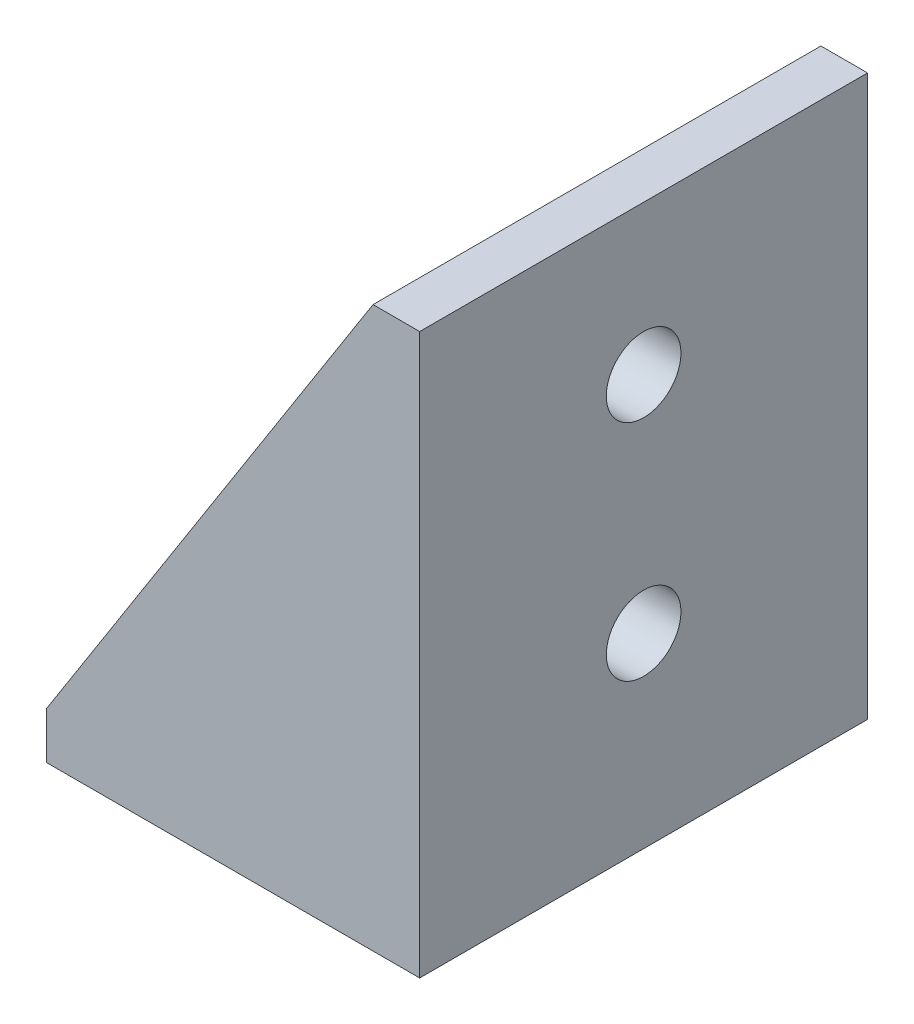
ISO-10303-21;
HEADER;
FILE_DESCRIPTION(('STEP AP214'),'2;1');
FILE_NAME('part.step','',(''),(''),'','','');
FILE_SCHEMA(('AUTOMOTIVE_DESIGN { 1 0 10303 214 1 1 1 1 }'));
ENDSEC;
DATA;
#1=APPLICATION_CONTEXT('core data for automotive mechanical design processes');
#2=APPLICATION_PROTOCOL_DEFINITION('international standard','automotive_design',2000,#1);
#3=PRODUCT_CONTEXT('',#1,'mechanical');
#4=PRODUCT('Part','Part','',(#3));
#5=PRODUCT_RELATED_PRODUCT_CATEGORY('part','',(#4));
#6=PRODUCT_DEFINITION_FORMATION('','',#4);
#7=PRODUCT_DEFINITION_CONTEXT('part definition',#1,'design');
#8=PRODUCT_DEFINITION('design','',#6,#7);
#9=PRODUCT_DEFINITION_SHAPE('','',#8);
#10=(LENGTH_UNIT() NAMED_UNIT(*) SI_UNIT(.MILLI.,.METRE.));
#11=(NAMED_UNIT(*) PLANE_ANGLE_UNIT() SI_UNIT($,.RADIAN.));
#12=(NAMED_UNIT(*) SI_UNIT($,.STERADIAN.) SOLID_ANGLE_UNIT());
#13=UNCERTAINTY_MEASURE_WITH_UNIT(LENGTH_MEASURE(1.E-05),#10,'distance_accuracy_value','');
#14=(GEOMETRIC_REPRESENTATION_CONTEXT(3) GLOBAL_UNCERTAINTY_ASSIGNED_CONTEXT((#13)) GLOBAL_UNIT_ASSIGNED_CONTEXT((#10,
#11,#12)) REPRESENTATION_CONTEXT('',''));
#15=CARTESIAN_POINT('',(0.,0.,0.));
#16=DIRECTION('',(0.,0.,1.));
#17=DIRECTION('',(1.,0.,0.));
#18=AXIS2_PLACEMENT_3D('',#15,#16,#17);
#19=CARTESIAN_POINT('',(20.,2.5,-18.3));
#20=DIRECTION('',(0.,0.,1.));
#21=DIRECTION('',(1.,0.,0.));
#22=AXIS2_PLACEMENT_3D('',#19,#20,#21);
#23=PLANE('',#22);
#24=DIRECTION('',(-1.,0.,0.));
#25=VECTOR('',#24,1.);
#26=CARTESIAN_POINT('',(15.3,4.5,-18.3));
#27=LINE('',#26,#25);
#28=CARTESIAN_POINT('',(15.3,4.5,-18.3));
#29=VERTEX_POINT('',#28);
#30=CARTESIAN_POINT('',(1.27272727272727,4.49999999999999,-18.3));
#31=VERTEX_POINT('',#30);
#32=EDGE_CURVE('E168',#29,#31,#27,.T.);
#33=ORIENTED_EDGE('',*,*,#32,.F.);
#34=DIRECTION('',(0.,-1.,0.));
#35=VECTOR('',#34,1.);
#36=CARTESIAN_POINT('',(15.3,26.5428571428571,-18.3));
#37=LINE('',#36,#35);
#38=CARTESIAN_POINT('',(15.3,26.5428571428571,-18.3));
#39=VERTEX_POINT('',#38);
#40=EDGE_CURVE('E179',#39,#29,#37,.T.);
#41=ORIENTED_EDGE('',*,*,#40,.F.);
#42=DIRECTION('',(0.536875492193159,0.843661487732108,0.));
#43=VECTOR('',#42,1.);
#44=CARTESIAN_POINT('',(17.5,30.,-18.3));
#45=LINE('',#44,#43);
#46=EDGE_CURVE('E42',#31,#39,#45,.T.);
#47=ORIENTED_EDGE('',*,*,#46,.F.);
#48=EDGE_LOOP('',(#33,#41,#47));
#49=FACE_BOUND('',#48,.T.);
#50=ADVANCED_FACE('F33',(#49),#23,.T.);
#51=CARTESIAN_POINT('',(20.,2.5,-1.7));
#52=DIRECTION('',(0.,0.,-1.));
#53=DIRECTION('',(-1.,0.,0.));
#54=AXIS2_PLACEMENT_3D('',#51,#52,#53);
#55=PLANE('',#54);
#56=DIRECTION('',(1.,0.,0.));
#57=VECTOR('',#56,1.);
#58=CARTESIAN_POINT('',(0.,4.5,-1.7));
#59=LINE('',#58,#57);
#60=CARTESIAN_POINT('',(1.27272727272727,4.49999999999999,-1.7));
#61=VERTEX_POINT('',#60);
#62=CARTESIAN_POINT('',(15.3,4.49999999999999,-1.7));
#63=VERTEX_POINT('',#62);
#64=EDGE_CURVE('E50',#61,#63,#59,.T.);
#65=ORIENTED_EDGE('',*,*,#64,.F.);
#66=DIRECTION('',(-0.536875492193159,-0.843661487732108,0.));
#67=VECTOR('',#66,1.);
#68=CARTESIAN_POINT('',(17.5,30.,-1.7));
#69=LINE('',#68,#67);
#70=CARTESIAN_POINT('',(15.3,26.5428571428571,-1.7));
#71=VERTEX_POINT('',#70);
#72=EDGE_CURVE('E194',#71,#61,#69,.T.);
#73=ORIENTED_EDGE('',*,*,#72,.F.);
#74=DIRECTION('',(0.,1.,0.));
#75=VECTOR('',#74,1.);
#76=CARTESIAN_POINT('',(15.3,26.5428571428571,-1.7));
#77=LINE('',#76,#75);
#78=EDGE_CURVE('E184',#63,#71,#77,.T.);
#79=ORIENTED_EDGE('',*,*,#78,.F.);
#80=EDGE_LOOP('',(#65,#73,#79));
#81=FACE_BOUND('',#80,.T.);
#82=ADVANCED_FACE('F231',(#81),#55,.T.);
#83=CARTESIAN_POINT('',(17.5,30.,-20.));
#84=DIRECTION('',(-0.843661487732108,0.536875492193159,0.));
#85=DIRECTION('',(-0.536875492193159,-0.843661487732108,0.));
#86=AXIS2_PLACEMENT_3D('',#83,#84,#85);
#87=PLANE('',#86);
#88=DIRECTION('',(0.,0.,1.));
#89=VECTOR('',#88,1.);
#90=CARTESIAN_POINT('',(0.,2.5,-20.));
#91=LINE('',#90,#89);
#92=CARTESIAN_POINT('',(0.,2.5,-1.7));
#93=VERTEX_POINT('',#92);
#94=CARTESIAN_POINT('',(0.,2.5,2.));
#95=VERTEX_POINT('',#94);
#96=EDGE_CURVE('E113',#93,#95,#91,.T.);
#97=ORIENTED_EDGE('',*,*,#96,.T.);
#98=DIRECTION('',(-0.536875492193159,-0.843661487732108,0.));
#99=VECTOR('',#98,1.);
#100=CARTESIAN_POINT('',(-1.13235294117647,0.720588235294116,2.));
#101=LINE('',#100,#99);
#102=CARTESIAN_POINT('',(17.5,30.,2.));
#103=VERTEX_POINT('',#102);
#104=EDGE_CURVE('E117',#103,#95,#101,.T.);
#105=ORIENTED_EDGE('',*,*,#104,.F.);
#106=DIRECTION('',(0.,0.,1.));
#107=VECTOR('',#106,1.);
#108=CARTESIAN_POINT('',(17.5,30.,-20.));
#109=LINE('',#108,#107);
#110=CARTESIAN_POINT('',(17.5,30.,-22.));
#111=VERTEX_POINT('',#110);
#112=EDGE_CURVE('E123',#111,#103,#109,.T.);
#113=ORIENTED_EDGE('',*,*,#112,.F.);
#114=DIRECTION('',(0.536875492193159,0.843661487732108,0.));
#115=VECTOR('',#114,1.);
#116=CARTESIAN_POINT('',(0.,2.5,-22.));
#117=LINE('',#116,#115);
#118=CARTESIAN_POINT('',(0.,2.5,-22.));
#119=VERTEX_POINT('',#118);
#120=EDGE_CURVE('E151',#119,#111,#117,.T.);
#121=ORIENTED_EDGE('',*,*,#120,.F.);
#122=CARTESIAN_POINT('',(0.,2.5,-18.3));
#123=VERTEX_POINT('',#122);
#124=EDGE_CURVE('E122',#119,#123,#91,.T.);
#125=ORIENTED_EDGE('',*,*,#124,.T.);
#126=EDGE_CURVE('E11',#123,#31,#45,.T.);
#127=ORIENTED_EDGE('',*,*,#126,.T.);
#128=ORIENTED_EDGE('',*,*,#46,.T.);
#129=DIRECTION('',(0.,0.,1.));
#130=VECTOR('',#129,1.);
#131=CARTESIAN_POINT('',(15.3,26.5428571428571,-20.002));
#132=LINE('',#131,#130);
#133=EDGE_CURVE('E182',#39,#71,#132,.T.);
#134=ORIENTED_EDGE('',*,*,#133,.T.);
#135=ORIENTED_EDGE('',*,*,#72,.T.);
#136=DIRECTION('',(-0.536875492193159,-0.843661487732108,0.));
#137=VECTOR('',#136,1.);
#138=CARTESIAN_POINT('',(17.5,30.,-1.7));
#139=LINE('',#138,#137);
#140=EDGE_CURVE('E119',#61,#93,#139,.T.);
#141=ORIENTED_EDGE('',*,*,#140,.T.);
#142=EDGE_LOOP('',(#97,#105,#113,#121,#125,#127,#128,#134,#135,#141));
#143=FACE_BOUND('',#142,.T.);
#144=ADVANCED_FACE('F115',(#143),#87,.T.);
#145=CARTESIAN_POINT('',(0.,2.5,-20.));
#146=DIRECTION('',(-1.,0.,0.));
#147=DIRECTION('',(0.,-1.,0.));
#148=AXIS2_PLACEMENT_3D('',#145,#146,#147);
#149=PLANE('',#148);
#150=DIRECTION('',(0.,0.,1.));
#151=VECTOR('',#150,1.);
#152=CARTESIAN_POINT('',(0.,0.,-20.));
#153=LINE('',#152,#151);
#154=CARTESIAN_POINT('',(0.,0.,-22.));
#155=VERTEX_POINT('',#154);
#156=CARTESIAN_POINT('',(0.,0.,2.));
#157=VERTEX_POINT('',#156);
#158=EDGE_CURVE('E128',#155,#157,#153,.T.);
#159=ORIENTED_EDGE('',*,*,#158,.T.);
#160=DIRECTION('',(0.,-1.,0.));
#161=VECTOR('',#160,1.);
#162=CARTESIAN_POINT('',(0.,0.,2.));
#163=LINE('',#162,#161);
#164=EDGE_CURVE('E126',#95,#157,#163,.T.);
#165=ORIENTED_EDGE('',*,*,#164,.F.);
#166=ORIENTED_EDGE('',*,*,#96,.F.);
#167=DIRECTION('',(0.,-1.,0.));
#168=VECTOR('',#167,1.);
#169=CARTESIAN_POINT('',(0.,4.5,-1.7));
#170=LINE('',#169,#168);
#171=CARTESIAN_POINT('',(0.,4.5,-1.7));
#172=VERTEX_POINT('',#171);
#173=EDGE_CURVE('E173',#172,#93,#170,.T.);
#174=ORIENTED_EDGE('',*,*,#173,.F.);
#175=DIRECTION('',(0.,0.,1.));
#176=VECTOR('',#175,1.);
#177=CARTESIAN_POINT('',(0.,4.5,-18.3));
#178=LINE('',#177,#176);
#179=CARTESIAN_POINT('',(0.,4.5,-18.3));
#180=VERTEX_POINT('',#179);
#181=EDGE_CURVE('E171',#180,#172,#178,.T.);
#182=ORIENTED_EDGE('',*,*,#181,.F.);
#183=DIRECTION('',(0.,-1.,0.));
#184=VECTOR('',#183,1.);
#185=CARTESIAN_POINT('',(0.,4.5,-18.3));
#186=LINE('',#185,#184);
#187=EDGE_CURVE('E175',#180,#123,#186,.T.);
#188=ORIENTED_EDGE('',*,*,#187,.T.);
#189=ORIENTED_EDGE('',*,*,#124,.F.);
#190=DIRECTION('',(0.,1.,0.));
#191=VECTOR('',#190,1.);
#192=CARTESIAN_POINT('',(0.,0.,-22.));
#193=LINE('',#192,#191);
#194=EDGE_CURVE('E148',#155,#119,#193,.T.);
#195=ORIENTED_EDGE('',*,*,#194,.F.);
#196=EDGE_LOOP('',(#159,#165,#166,#174,#182,#188,#189,#195));
#197=FACE_BOUND('',#196,.T.);
#198=ADVANCED_FACE('F35',(#197),#149,.T.);
#199=CARTESIAN_POINT('',(20.,30.,-20.));
#200=DIRECTION('',(0.,1.,0.));
#201=DIRECTION('',(0.,0.,1.));
#202=AXIS2_PLACEMENT_3D('',#199,#200,#201);
#203=PLANE('',#202);
#204=ORIENTED_EDGE('',*,*,#112,.T.);
#205=DIRECTION('',(-1.,0.,0.));
#206=VECTOR('',#205,1.);
#207=CARTESIAN_POINT('',(0.,30.,2.));
#208=LINE('',#207,#206);
#209=CARTESIAN_POINT('',(20.,30.,2.));
#210=VERTEX_POINT('',#209);
#211=EDGE_CURVE('E138',#210,#103,#208,.T.);
#212=ORIENTED_EDGE('',*,*,#211,.F.);
#213=DIRECTION('',(0.,0.,1.));
#214=VECTOR('',#213,1.);
#215=CARTESIAN_POINT('',(20.,30.,-20.));
#216=LINE('',#215,#214);
#217=CARTESIAN_POINT('',(20.,30.,-22.));
#218=VERTEX_POINT('',#217);
#219=EDGE_CURVE('E196',#218,#210,#216,.T.);
#220=ORIENTED_EDGE('',*,*,#219,.F.);
#221=DIRECTION('',(1.,0.,0.));
#222=VECTOR('',#221,1.);
#223=CARTESIAN_POINT('',(17.5,30.,-22.));
#224=LINE('',#223,#222);
#225=EDGE_CURVE('E154',#111,#218,#224,.T.);
#226=ORIENTED_EDGE('',*,*,#225,.F.);
#227=EDGE_LOOP('',(#204,#212,#220,#226));
#228=FACE_BOUND('',#227,.T.);
#229=ADVANCED_FACE('F244',(#228),#203,.T.);
#230=CARTESIAN_POINT('',(20.,0.,-20.));
#231=DIRECTION('',(1.,0.,0.));
#232=DIRECTION('',(0.,0.,-1.));
#233=AXIS2_PLACEMENT_3D('',#230,#231,#232);
#234=PLANE('',#233);
#235=CARTESIAN_POINT('',(20.,22.,-10.));
#236=DIRECTION('',(1.,0.,0.));
#237=DIRECTION('',(0.,0.,-1.));
#238=AXIS2_PLACEMENT_3D('',#235,#236,#237);
#239=CIRCLE('',#238,2.);
#240=CARTESIAN_POINT('',(20.,22.,-12.));
#241=VERTEX_POINT('',#240);
#242=EDGE_CURVE('E188',#241,#241,#239,.F.);
#243=ORIENTED_EDGE('',*,*,#242,.T.);
#244=EDGE_LOOP('',(#243));
#245=FACE_BOUND('',#244,.T.);
#246=CARTESIAN_POINT('',(20.,10.,-10.));
#247=DIRECTION('',(1.,0.,0.));
#248=DIRECTION('',(0.,0.,-1.));
#249=AXIS2_PLACEMENT_3D('',#246,#247,#248);
#250=CIRCLE('',#249,2.);
#251=CARTESIAN_POINT('',(20.,10.,-12.));
#252=VERTEX_POINT('',#251);
#253=EDGE_CURVE('E186',#252,#252,#250,.F.);
#254=ORIENTED_EDGE('',*,*,#253,.T.);
#255=EDGE_LOOP('',(#254));
#256=FACE_BOUND('',#255,.T.);
#257=ORIENTED_EDGE('',*,*,#219,.T.);
#258=DIRECTION('',(0.,1.,0.));
#259=VECTOR('',#258,1.);
#260=CARTESIAN_POINT('',(20.,0.,2.));
#261=LINE('',#260,#259);
#262=CARTESIAN_POINT('',(20.,0.,2.));
#263=VERTEX_POINT('',#262);
#264=EDGE_CURVE('E142',#263,#210,#261,.T.);
#265=ORIENTED_EDGE('',*,*,#264,.F.);
#266=DIRECTION('',(0.,0.,1.));
#267=VECTOR('',#266,1.);
#268=CARTESIAN_POINT('',(20.,0.,-20.));
#269=LINE('',#268,#267);
#270=CARTESIAN_POINT('',(20.,0.,-22.));
#271=VERTEX_POINT('',#270);
#272=EDGE_CURVE('E198',#271,#263,#269,.T.);
#273=ORIENTED_EDGE('',*,*,#272,.F.);
#274=DIRECTION('',(0.,-1.,0.));
#275=VECTOR('',#274,1.);
#276=CARTESIAN_POINT('',(20.,30.,-22.));
#277=LINE('',#276,#275);
#278=EDGE_CURVE('E157',#218,#271,#277,.T.);
#279=ORIENTED_EDGE('',*,*,#278,.F.);
#280=EDGE_LOOP('',(#257,#265,#273,#279));
#281=FACE_BOUND('',#280,.T.);
#282=ADVANCED_FACE('F247',(#245,#256,#281),#234,.T.);
#283=CARTESIAN_POINT('',(0.,0.,-20.));
#284=DIRECTION('',(0.,-1.,0.));
#285=DIRECTION('',(0.,0.,-1.));
#286=AXIS2_PLACEMENT_3D('',#283,#284,#285);
#287=PLANE('',#286);
#288=CARTESIAN_POINT('',(9.,0.,-10.));
#289=DIRECTION('',(0.,-1.,0.));
#290=DIRECTION('',(0.,0.,-1.));
#291=AXIS2_PLACEMENT_3D('',#288,#289,#290);
#292=CIRCLE('',#291,1.7);
#293=CARTESIAN_POINT('',(9.,0.,-11.7));
#294=VERTEX_POINT('',#293);
#295=EDGE_CURVE('E37',#294,#294,#292,.F.);
#296=ORIENTED_EDGE('',*,*,#295,.T.);
#297=EDGE_LOOP('',(#296));
#298=FACE_BOUND('',#297,.T.);
#299=ORIENTED_EDGE('',*,*,#272,.T.);
#300=DIRECTION('',(1.,0.,0.));
#301=VECTOR('',#300,1.);
#302=CARTESIAN_POINT('',(0.,0.,2.));
#303=LINE('',#302,#301);
#304=EDGE_CURVE('E132',#157,#263,#303,.T.);
#305=ORIENTED_EDGE('',*,*,#304,.F.);
#306=ORIENTED_EDGE('',*,*,#158,.F.);
#307=DIRECTION('',(-1.,0.,0.));
#308=VECTOR('',#307,1.);
#309=CARTESIAN_POINT('',(20.,0.,-22.));
#310=LINE('',#309,#308);
#311=EDGE_CURVE('E145',#271,#155,#310,.T.);
#312=ORIENTED_EDGE('',*,*,#311,.F.);
#313=EDGE_LOOP('',(#299,#305,#306,#312));
#314=FACE_BOUND('',#313,.T.);
#315=ADVANCED_FACE('F250',(#298,#314),#287,.T.);
#316=CARTESIAN_POINT('',(20.001,10.,-10.));
#317=DIRECTION('',(-1.,0.,0.));
#318=DIRECTION('',(0.,0.,1.));
#319=AXIS2_PLACEMENT_3D('',#316,#317,#318);
#320=CYLINDRICAL_SURFACE('',#319,2.);
#321=ORIENTED_EDGE('',*,*,#253,.F.);
#322=EDGE_LOOP('',(#321));
#323=FACE_BOUND('',#322,.T.);
#324=CARTESIAN_POINT('',(15.3,10.,-10.));
#325=DIRECTION('',(1.,0.,0.));
#326=DIRECTION('',(0.,0.,-1.));
#327=AXIS2_PLACEMENT_3D('',#324,#325,#326);
#328=CIRCLE('',#327,2.);
#329=CARTESIAN_POINT('',(15.3,10.,-12.));
#330=VERTEX_POINT('',#329);
#331=EDGE_CURVE('E202',#330,#330,#328,.F.);
#332=ORIENTED_EDGE('',*,*,#331,.T.);
#333=EDGE_LOOP('',(#332));
#334=FACE_BOUND('',#333,.T.);
#335=ADVANCED_FACE('F241',(#323,#334),#320,.F.);
#336=CARTESIAN_POINT('',(20.001,22.,-10.));
#337=DIRECTION('',(-1.,0.,0.));
#338=DIRECTION('',(0.,0.,1.));
#339=AXIS2_PLACEMENT_3D('',#336,#337,#338);
#340=CYLINDRICAL_SURFACE('',#339,2.);
#341=ORIENTED_EDGE('',*,*,#242,.F.);
#342=EDGE_LOOP('',(#341));
#343=FACE_BOUND('',#342,.T.);
#344=CARTESIAN_POINT('',(15.3,22.,-10.));
#345=DIRECTION('',(1.,0.,0.));
#346=DIRECTION('',(0.,0.,-1.));
#347=AXIS2_PLACEMENT_3D('',#344,#345,#346);
#348=CIRCLE('',#347,2.);
#349=CARTESIAN_POINT('',(15.3,22.,-12.));
#350=VERTEX_POINT('',#349);
#351=EDGE_CURVE('E183',#350,#350,#348,.F.);
#352=ORIENTED_EDGE('',*,*,#351,.T.);
#353=EDGE_LOOP('',(#352));
#354=FACE_BOUND('',#353,.T.);
#355=ADVANCED_FACE('F207',(#343,#354),#340,.F.);
#356=CARTESIAN_POINT('',(15.3,26.5428571428571,-20.002));
#357=DIRECTION('',(1.,0.,0.));
#358=DIRECTION('',(0.,0.,-1.));
#359=AXIS2_PLACEMENT_3D('',#356,#357,#358);
#360=PLANE('',#359);
#361=ORIENTED_EDGE('',*,*,#351,.F.);
#362=EDGE_LOOP('',(#361));
#363=FACE_BOUND('',#362,.T.);
#364=ORIENTED_EDGE('',*,*,#331,.F.);
#365=EDGE_LOOP('',(#364));
#366=FACE_BOUND('',#365,.T.);
#367=ORIENTED_EDGE('',*,*,#40,.T.);
#368=DIRECTION('',(0.,0.,-1.));
#369=VECTOR('',#368,1.);
#370=CARTESIAN_POINT('',(15.3,4.5,-1.7));
#371=LINE('',#370,#369);
#372=EDGE_CURVE('E165',#63,#29,#371,.T.);
#373=ORIENTED_EDGE('',*,*,#372,.F.);
#374=ORIENTED_EDGE('',*,*,#78,.T.);
#375=ORIENTED_EDGE('',*,*,#133,.F.);
#376=EDGE_LOOP('',(#367,#373,#374,#375));
#377=FACE_BOUND('',#376,.T.);
#378=ADVANCED_FACE('F209',(#363,#366,#377),#360,.F.);
#379=CARTESIAN_POINT('',(9.,30.,-10.));
#380=DIRECTION('',(0.,-1.,0.));
#381=DIRECTION('',(0.,0.,-1.));
#382=AXIS2_PLACEMENT_3D('',#379,#380,#381);
#383=CYLINDRICAL_SURFACE('',#382,1.7);
#384=ORIENTED_EDGE('',*,*,#295,.F.);
#385=EDGE_LOOP('',(#384));
#386=FACE_BOUND('',#385,.T.);
#387=CARTESIAN_POINT('',(9.,4.5,-10.));
#388=DIRECTION('',(0.,1.,0.));
#389=DIRECTION('',(0.,0.,1.));
#390=AXIS2_PLACEMENT_3D('',#387,#388,#389);
#391=CIRCLE('',#390,1.7);
#392=CARTESIAN_POINT('',(9.,4.5,-8.3));
#393=VERTEX_POINT('',#392);
#394=EDGE_CURVE('E160',#393,#393,#391,.T.);
#395=ORIENTED_EDGE('',*,*,#394,.T.);
#396=EDGE_LOOP('',(#395));
#397=FACE_BOUND('',#396,.T.);
#398=ADVANCED_FACE('F212',(#386,#397),#383,.F.);
#399=CARTESIAN_POINT('',(0.,4.5,0.));
#400=DIRECTION('',(0.,1.,0.));
#401=DIRECTION('',(0.,0.,1.));
#402=AXIS2_PLACEMENT_3D('',#399,#400,#401);
#403=PLANE('',#402);
#404=EDGE_CURVE('E163',#172,#61,#59,.T.);
#405=ORIENTED_EDGE('',*,*,#404,.T.);
#406=ORIENTED_EDGE('',*,*,#64,.T.);
#407=ORIENTED_EDGE('',*,*,#372,.T.);
#408=ORIENTED_EDGE('',*,*,#32,.T.);
#409=EDGE_CURVE('E167',#31,#180,#27,.T.);
#410=ORIENTED_EDGE('',*,*,#409,.T.);
#411=ORIENTED_EDGE('',*,*,#181,.T.);
#412=EDGE_LOOP('',(#405,#406,#407,#408,#410,#411));
#413=FACE_BOUND('',#412,.T.);
#414=ORIENTED_EDGE('',*,*,#394,.F.);
#415=EDGE_LOOP('',(#414));
#416=FACE_BOUND('',#415,.T.);
#417=ADVANCED_FACE('F220',(#413,#416),#403,.T.);
#418=CARTESIAN_POINT('',(0.,4.5,-1.7));
#419=DIRECTION('',(0.,0.,-1.));
#420=DIRECTION('',(-1.,0.,0.));
#421=AXIS2_PLACEMENT_3D('',#418,#419,#420);
#422=PLANE('',#421);
#423=ORIENTED_EDGE('',*,*,#140,.F.);
#424=ORIENTED_EDGE('',*,*,#404,.F.);
#425=ORIENTED_EDGE('',*,*,#173,.T.);
#426=EDGE_LOOP('',(#423,#424,#425));
#427=FACE_BOUND('',#426,.T.);
#428=ADVANCED_FACE('F228',(#427),#422,.F.);
#429=CARTESIAN_POINT('',(15.3,4.5,-18.3));
#430=DIRECTION('',(0.,0.,1.));
#431=DIRECTION('',(1.,0.,0.));
#432=AXIS2_PLACEMENT_3D('',#429,#430,#431);
#433=PLANE('',#432);
#434=ORIENTED_EDGE('',*,*,#126,.F.);
#435=ORIENTED_EDGE('',*,*,#187,.F.);
#436=ORIENTED_EDGE('',*,*,#409,.F.);
#437=EDGE_LOOP('',(#434,#435,#436));
#438=FACE_BOUND('',#437,.T.);
#439=ADVANCED_FACE('F225',(#438),#433,.F.);
#440=CARTESIAN_POINT('',(0.,0.,-22.));
#441=DIRECTION('',(0.,0.,-1.));
#442=DIRECTION('',(-1.,0.,0.));
#443=AXIS2_PLACEMENT_3D('',#440,#441,#442);
#444=PLANE('',#443);
#445=ORIENTED_EDGE('',*,*,#311,.T.);
#446=ORIENTED_EDGE('',*,*,#194,.T.);
#447=ORIENTED_EDGE('',*,*,#120,.T.);
#448=ORIENTED_EDGE('',*,*,#225,.T.);
#449=ORIENTED_EDGE('',*,*,#278,.T.);
#450=EDGE_LOOP('',(#445,#446,#447,#448,#449));
#451=FACE_BOUND('',#450,.T.);
#452=ADVANCED_FACE('F267',(#451),#444,.T.);
#453=CARTESIAN_POINT('',(0.,0.,2.));
#454=DIRECTION('',(0.,0.,1.));
#455=DIRECTION('',(1.,0.,0.));
#456=AXIS2_PLACEMENT_3D('',#453,#454,#455);
#457=PLANE('',#456);
#458=ORIENTED_EDGE('',*,*,#104,.T.);
#459=ORIENTED_EDGE('',*,*,#164,.T.);
#460=ORIENTED_EDGE('',*,*,#304,.T.);
#461=ORIENTED_EDGE('',*,*,#264,.T.);
#462=ORIENTED_EDGE('',*,*,#211,.T.);
#463=EDGE_LOOP('',(#458,#459,#460,#461,#462));
#464=FACE_BOUND('',#463,.T.);
#465=ADVANCED_FACE('F135',(#464),#457,.T.);
#466=CLOSED_SHELL('',(#50,#82,#144,#198,#229,#282,#315,#335,#355,#378,#398,#417,#428,#439,#452,#465));
#467=MANIFOLD_SOLID_BREP('B2',#466);
#468=ADVANCED_BREP_SHAPE_REPRESENTATION('',(#18,#467),#14);
#469=SHAPE_DEFINITION_REPRESENTATION(#9,#468);
ENDSEC;
END-ISO-10303-21;
